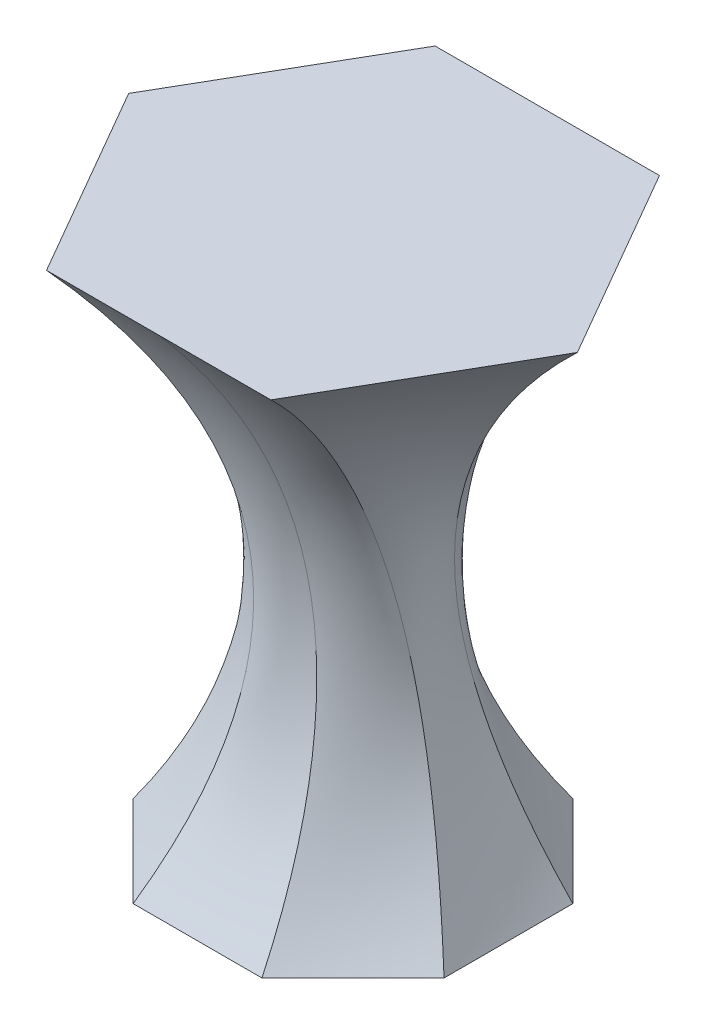
ISO-10303-21;
HEADER;
FILE_DESCRIPTION(('STEP AP214'),'2;1');
FILE_NAME('part.step','',(''),(''),'','','');
FILE_SCHEMA(('AUTOMOTIVE_DESIGN { 1 0 10303 214 1 1 1 1 }'));
ENDSEC;
DATA;
#1=APPLICATION_CONTEXT('core data for automotive mechanical design processes');
#2=APPLICATION_PROTOCOL_DEFINITION('international standard','automotive_design',2000,#1);
#3=PRODUCT_CONTEXT('',#1,'mechanical');
#4=PRODUCT('Part','Part','',(#3));
#5=PRODUCT_RELATED_PRODUCT_CATEGORY('part','',(#4));
#6=PRODUCT_DEFINITION_FORMATION('','',#4);
#7=PRODUCT_DEFINITION_CONTEXT('part definition',#1,'design');
#8=PRODUCT_DEFINITION('design','',#6,#7);
#9=PRODUCT_DEFINITION_SHAPE('','',#8);
#10=(LENGTH_UNIT() NAMED_UNIT(*) SI_UNIT(.MILLI.,.METRE.));
#11=(NAMED_UNIT(*) PLANE_ANGLE_UNIT() SI_UNIT($,.RADIAN.));
#12=(NAMED_UNIT(*) SI_UNIT($,.STERADIAN.) SOLID_ANGLE_UNIT());
#13=UNCERTAINTY_MEASURE_WITH_UNIT(LENGTH_MEASURE(1.E-05),#10,'distance_accuracy_value','');
#14=(GEOMETRIC_REPRESENTATION_CONTEXT(3) GLOBAL_UNCERTAINTY_ASSIGNED_CONTEXT((#13)) GLOBAL_UNIT_ASSIGNED_CONTEXT((#10,
#11,#12)) REPRESENTATION_CONTEXT('',''));
#15=CARTESIAN_POINT('',(0.,0.,0.));
#16=DIRECTION('',(0.,0.,1.));
#17=DIRECTION('',(1.,0.,0.));
#18=AXIS2_PLACEMENT_3D('',#15,#16,#17);
#19=CARTESIAN_POINT('',(0.,140.,0.));
#20=DIRECTION('',(0.,1.,0.));
#21=DIRECTION('',(0.,0.,1.));
#22=AXIS2_PLACEMENT_3D('',#19,#20,#21);
#23=PLANE('',#22);
#24=DIRECTION('',(1.,0.,0.));
#25=VECTOR('',#24,1.);
#26=CARTESIAN_POINT('',(-144.448851571674,140.,41.1277566887757));
#27=LINE('',#26,#25);
#28=CARTESIAN_POINT('',(-144.448851571674,140.,41.1277566887757));
#29=VERTEX_POINT('',#28);
#30=CARTESIAN_POINT('',(-115.581338112193,140.,41.1277566887757));
#31=VERTEX_POINT('',#30);
#32=EDGE_CURVE('E66',#29,#31,#27,.T.);
#33=ORIENTED_EDGE('',*,*,#32,.T.);
#34=CARTESIAN_POINT('',(-86.7138246527114,140.,41.1277566887757));
#35=VERTEX_POINT('',#34);
#36=EDGE_CURVE('E261',#31,#35,#27,.T.);
#37=ORIENTED_EDGE('',*,*,#36,.T.);
#38=DIRECTION('',(0.5,0.,-0.866025403784439));
#39=VECTOR('',#38,1.);
#40=CARTESIAN_POINT('',(-86.7138246527114,140.,41.1277566887757));
#41=LINE('',#40,#39);
#42=CARTESIAN_POINT('',(-57.8463111932301,140.,-8.87224331122428));
#43=VERTEX_POINT('',#42);
#44=EDGE_CURVE('E252',#35,#43,#41,.T.);
#45=ORIENTED_EDGE('',*,*,#44,.T.);
#46=DIRECTION('',(-0.5,0.,-0.866025403784439));
#47=VECTOR('',#46,1.);
#48=CARTESIAN_POINT('',(-57.8463111932301,140.,-8.87224331122428));
#49=LINE('',#48,#47);
#50=CARTESIAN_POINT('',(-86.7138246527114,140.,-58.8722433112243));
#51=VERTEX_POINT('',#50);
#52=EDGE_CURVE('E242',#43,#51,#49,.T.);
#53=ORIENTED_EDGE('',*,*,#52,.T.);
#54=DIRECTION('',(-1.,0.,0.));
#55=VECTOR('',#54,1.);
#56=CARTESIAN_POINT('',(-86.7138246527114,140.,-58.8722433112243));
#57=LINE('',#56,#55);
#58=CARTESIAN_POINT('',(-115.581338112193,140.,-58.8722433112243));
#59=VERTEX_POINT('',#58);
#60=EDGE_CURVE('E74',#51,#59,#57,.T.);
#61=ORIENTED_EDGE('',*,*,#60,.T.);
#62=CARTESIAN_POINT('',(-144.448851571674,140.,-58.8722433112243));
#63=VERTEX_POINT('',#62);
#64=EDGE_CURVE('E148',#59,#63,#57,.T.);
#65=ORIENTED_EDGE('',*,*,#64,.T.);
#66=DIRECTION('',(-0.5,0.,0.866025403784439));
#67=VECTOR('',#66,1.);
#68=CARTESIAN_POINT('',(-144.448851571674,140.,-58.8722433112243));
#69=LINE('',#68,#67);
#70=CARTESIAN_POINT('',(-173.316365031155,140.,-8.87224331122428));
#71=VERTEX_POINT('',#70);
#72=EDGE_CURVE('E59',#63,#71,#69,.T.);
#73=ORIENTED_EDGE('',*,*,#72,.T.);
#74=DIRECTION('',(0.5,0.,0.866025403784438));
#75=VECTOR('',#74,1.);
#76=CARTESIAN_POINT('',(-173.316365031155,140.,-8.87224331122428));
#77=LINE('',#76,#75);
#78=EDGE_CURVE('E12',#71,#29,#77,.T.);
#79=ORIENTED_EDGE('',*,*,#78,.T.);
#80=EDGE_LOOP('',(#33,#37,#45,#53,#61,#65,#73,#79));
#81=FACE_BOUND('',#80,.T.);
#82=ADVANCED_FACE('F49',(#81),#23,.T.);
#83=CARTESIAN_POINT('',(0.,0.,0.));
#84=DIRECTION('',(0.,1.,0.));
#85=DIRECTION('',(0.,0.,1.));
#86=AXIS2_PLACEMENT_3D('',#83,#84,#85);
#87=PLANE('',#86);
#88=DIRECTION('',(-1.,0.,0.));
#89=VECTOR('',#88,1.);
#90=CARTESIAN_POINT('',(-99.0127956172689,0.,-48.8722433112243));
#91=LINE('',#90,#89);
#92=CARTESIAN_POINT('',(-99.0127956172689,0.,-48.8722433112243));
#93=VERTEX_POINT('',#92);
#94=CARTESIAN_POINT('',(-132.149880607117,0.,-48.8722433112243));
#95=VERTEX_POINT('',#94);
#96=EDGE_CURVE('E124',#93,#95,#91,.T.);
#97=ORIENTED_EDGE('',*,*,#96,.F.);
#98=DIRECTION('',(-0.707106781186548,0.,-0.707106781186547));
#99=VECTOR('',#98,1.);
#100=CARTESIAN_POINT('',(-75.5813381121927,0.,-25.4407858061481));
#101=LINE('',#100,#99);
#102=CARTESIAN_POINT('',(-75.5813381121927,0.,-25.4407858061481));
#103=VERTEX_POINT('',#102);
#104=EDGE_CURVE('E388',#103,#93,#101,.T.);
#105=ORIENTED_EDGE('',*,*,#104,.F.);
#106=DIRECTION('',(0.,0.,-1.));
#107=VECTOR('',#106,1.);
#108=CARTESIAN_POINT('',(-75.5813381121927,0.,7.69629918369949));
#109=LINE('',#108,#107);
#110=CARTESIAN_POINT('',(-75.5813381121927,0.,7.69629918369949));
#111=VERTEX_POINT('',#110);
#112=EDGE_CURVE('E401',#111,#103,#109,.T.);
#113=ORIENTED_EDGE('',*,*,#112,.F.);
#114=DIRECTION('',(0.707106781186548,0.,-0.707106781186547));
#115=VECTOR('',#114,1.);
#116=CARTESIAN_POINT('',(-99.0127956172689,0.,31.1277566887757));
#117=LINE('',#116,#115);
#118=CARTESIAN_POINT('',(-99.0127956172689,0.,31.1277566887757));
#119=VERTEX_POINT('',#118);
#120=EDGE_CURVE('E308',#119,#111,#117,.T.);
#121=ORIENTED_EDGE('',*,*,#120,.F.);
#122=DIRECTION('',(1.,0.,0.));
#123=VECTOR('',#122,1.);
#124=CARTESIAN_POINT('',(-132.149880607116,0.,31.1277566887757));
#125=LINE('',#124,#123);
#126=CARTESIAN_POINT('',(-132.149880607116,0.,31.1277566887757));
#127=VERTEX_POINT('',#126);
#128=EDGE_CURVE('E289',#127,#119,#125,.T.);
#129=ORIENTED_EDGE('',*,*,#128,.F.);
#130=DIRECTION('',(0.707106781186548,0.,0.707106781186547));
#131=VECTOR('',#130,1.);
#132=CARTESIAN_POINT('',(-155.581338112193,0.,7.69629918369954));
#133=LINE('',#132,#131);
#134=CARTESIAN_POINT('',(-155.581338112193,0.,7.69629918369954));
#135=VERTEX_POINT('',#134);
#136=EDGE_CURVE('E474',#135,#127,#133,.T.);
#137=ORIENTED_EDGE('',*,*,#136,.F.);
#138=DIRECTION('',(0.,0.,1.));
#139=VECTOR('',#138,1.);
#140=CARTESIAN_POINT('',(-155.581338112193,0.,-25.4407858061481));
#141=LINE('',#140,#139);
#142=CARTESIAN_POINT('',(-155.581338112193,0.,-25.4407858061481));
#143=VERTEX_POINT('',#142);
#144=EDGE_CURVE('E127',#143,#135,#141,.T.);
#145=ORIENTED_EDGE('',*,*,#144,.F.);
#146=DIRECTION('',(-0.707106781186546,0.,0.707106781186548));
#147=VECTOR('',#146,1.);
#148=CARTESIAN_POINT('',(-132.149880607117,0.,-48.8722433112243));
#149=LINE('',#148,#147);
#150=EDGE_CURVE('E120',#95,#143,#149,.T.);
#151=ORIENTED_EDGE('',*,*,#150,.F.);
#152=EDGE_LOOP('',(#97,#105,#113,#121,#129,#137,#145,#151));
#153=FACE_BOUND('',#152,.T.);
#154=ADVANCED_FACE('F123',(#153),#87,.F.);
#155=CARTESIAN_POINT('',(-75.5813381121927,0.,-25.4407858061481));
#156=CARTESIAN_POINT('',(-92.7306903398248,24.5549942298875,-22.1143807487044));
#157=CARTESIAN_POINT('',(-106.985200264323,72.1735908487958,-16.0579170611513));
#158=CARTESIAN_POINT('',(-80.9073390605164,117.888327563221,-11.0686857520886));
#159=CARTESIAN_POINT('',(-57.8463111932301,140.,-8.87224331122428));
#160=CARTESIAN_POINT('',(-83.3918239472181,0.,-33.2512716411735));
#161=CARTESIAN_POINT('',(-97.4580724378477,24.5007882693305,-25.7205703905838));
#162=CARTESIAN_POINT('',(-105.748698651671,72.2279403583067,-19.5111059139139));
#163=CARTESIAN_POINT('',(-86.8427335928516,117.834121602664,-20.5789959483955));
#164=CARTESIAN_POINT('',(-67.4688156797239,140.,-25.538909977891));
#165=CARTESIAN_POINT('',(-91.2023097822435,0.,-41.0617574761989));
#166=CARTESIAN_POINT('',(-102.185454535871,24.4465823087735,-29.3267600324632));
#167=CARTESIAN_POINT('',(-108.244844102785,72.2822898678176,-20.9481371507312));
#168=CARTESIAN_POINT('',(-92.7781281251868,117.779915642107,-30.0893061447024));
#169=CARTESIAN_POINT('',(-77.0913201662176,140.,-42.2055766445576));
#170=CARTESIAN_POINT('',(-99.0127956172689,0.,-48.8722433112243));
#171=CARTESIAN_POINT('',(-106.912836633894,24.3923763482166,-32.9329496743426));
#172=CARTESIAN_POINT('',(-112.757147169846,72.3366393773286,-18.6525213237814));
#173=CARTESIAN_POINT('',(-98.713522657522,117.72570968155,-39.5996163410093));
#174=CARTESIAN_POINT('',(-86.7138246527114,140.,-58.8722433112243));
#175=B_SPLINE_SURFACE_WITH_KNOTS('',3,3,((#155,#156,#157,#158,#159),(#160,#161,#162,#163,#164),
(#165,#166,#167,#168,#169),(#170,#171,#172,#173,#174)),.UNSPECIFIED.,.F.,.F.,.F.,(4,4),(4,1,4),
(0.,1.),(0.,0.481817894882484,1.),.UNSPECIFIED.);
#176=CARTESIAN_POINT('',(-99.0127956172689,0.,-48.8722433112243));
#177=CARTESIAN_POINT('',(-106.912836633894,24.3923763482166,-32.9329496743426));
#178=CARTESIAN_POINT('',(-112.757147169846,72.3366393773286,-18.6525213237814));
#179=CARTESIAN_POINT('',(-98.713522657522,117.72570968155,-39.5996163410093));
#180=CARTESIAN_POINT('',(-86.7138246527114,140.,-58.8722433112243));
#181=B_SPLINE_CURVE_WITH_KNOTS('',3,(#176,#177,#178,#179,#180),.UNSPECIFIED.,.F.,.F.,(4,1,4),
(0.,0.481817894882484,1.),.UNSPECIFIED.);
#182=EDGE_CURVE('E142',#93,#51,#181,.T.);
#183=CARTESIAN_POINT('',(-75.5813381121927,0.,-25.4407858061481));
#184=CARTESIAN_POINT('',(-92.7306903398248,24.5549942298875,-22.1143807487044));
#185=CARTESIAN_POINT('',(-106.985200264323,72.1735908487958,-16.0579170611513));
#186=CARTESIAN_POINT('',(-80.9073390605164,117.888327563221,-11.0686857520886));
#187=CARTESIAN_POINT('',(-57.8463111932301,140.,-8.87224331122428));
#188=B_SPLINE_CURVE_WITH_KNOTS('',3,(#183,#184,#185,#186,#187),.UNSPECIFIED.,.F.,.F.,(4,1,4),
(0.,0.481817894882484,1.),.UNSPECIFIED.);
#189=EDGE_CURVE('E154',#43,#103,#188,.F.);
#190=ORIENTED_EDGE('',*,*,#104,.T.);
#191=ORIENTED_EDGE('',*,*,#182,.T.);
#192=ORIENTED_EDGE('',*,*,#52,.F.);
#193=ORIENTED_EDGE('',*,*,#189,.T.);
#194=EDGE_LOOP('',(#190,#191,#192,#193));
#195=FACE_BOUND('',#194,.T.);
#196=ADVANCED_FACE('F356',(#195),#175,.T.);
#197=CARTESIAN_POINT('',(-99.0127956172689,0.,-48.8722433112243));
#198=CARTESIAN_POINT('',(-106.912836633894,24.3923763482166,-32.9329496743426));
#199=CARTESIAN_POINT('',(-112.757147169846,72.3366393773286,-18.6525213237814));
#200=CARTESIAN_POINT('',(-98.713522657522,117.72570968155,-39.5996163410093));
#201=CARTESIAN_POINT('',(-86.7138246527114,140.,-58.8722433112243));
#202=CARTESIAN_POINT('',(-110.058490613885,0.,-48.8722433112243));
#203=CARTESIAN_POINT('',(-114.241094734915,24.2377738751018,-32.9219066405487));
#204=CARTESIAN_POINT('',(-115.664411053269,72.4916512707924,-22.7286123746275));
#205=CARTESIAN_POINT('',(-105.092987085128,117.571107208435,-39.5885733072154));
#206=CARTESIAN_POINT('',(-96.3363291392051,140.,-58.8722433112243));
#207=CARTESIAN_POINT('',(-121.104185610501,0.,-48.8722433112243));
#208=CARTESIAN_POINT('',(-121.569352835936,24.0831714019871,-32.9108636067548));
#209=CARTESIAN_POINT('',(-119.785416265082,72.6466631642562,-22.739684652732));
#210=CARTESIAN_POINT('',(-111.472451512735,117.41650473532,-39.5775302734215));
#211=CARTESIAN_POINT('',(-105.958833625699,140.,-58.8722433112243));
#212=CARTESIAN_POINT('',(-132.149880607117,0.,-48.8722433112243));
#213=CARTESIAN_POINT('',(-128.897610936957,23.9285689288724,-32.8998205729609));
#214=CARTESIAN_POINT('',(-122.692680148506,72.80167505772,-18.6857381580951));
#215=CARTESIAN_POINT('',(-117.851915940341,117.261902262206,-39.5664872396275));
#216=CARTESIAN_POINT('',(-115.581338112193,140.,-58.8722433112243));
#217=B_SPLINE_SURFACE_WITH_KNOTS('',3,3,((#197,#198,#199,#200,#201),(#202,#203,#204,#205,#206),
(#207,#208,#209,#210,#211),(#212,#213,#214,#215,#216)),.UNSPECIFIED.,.F.,.F.,.F.,(4,4),(4,1,4),
(0.,1.),(0.,0.481817894882484,1.),.UNSPECIFIED.);
#218=CARTESIAN_POINT('',(-132.149880607117,0.,-48.8722433112243));
#219=CARTESIAN_POINT('',(-128.897610936957,23.9285689288724,-32.8998205729609));
#220=CARTESIAN_POINT('',(-122.692680148506,72.80167505772,-18.6857381580951));
#221=CARTESIAN_POINT('',(-117.851915940341,117.261902262206,-39.5664872396275));
#222=CARTESIAN_POINT('',(-115.581338112193,140.,-58.8722433112243));
#223=B_SPLINE_CURVE_WITH_KNOTS('',3,(#218,#219,#220,#221,#222),.UNSPECIFIED.,.F.,.F.,(4,1,4),
(0.,0.481817894882484,1.),.UNSPECIFIED.);
#224=EDGE_CURVE('E141',#95,#59,#223,.T.);
#225=ORIENTED_EDGE('',*,*,#96,.T.);
#226=ORIENTED_EDGE('',*,*,#224,.T.);
#227=ORIENTED_EDGE('',*,*,#60,.F.);
#228=ORIENTED_EDGE('',*,*,#182,.F.);
#229=EDGE_LOOP('',(#225,#226,#227,#228));
#230=FACE_BOUND('',#229,.T.);
#231=ADVANCED_FACE('F140',(#230),#217,.T.);
#232=CARTESIAN_POINT('',(-75.5813381121927,0.,7.69629918369949));
#233=CARTESIAN_POINT('',(-88.1951341083969,24.8542202175706,-3.45567773765355));
#234=CARTESIAN_POINT('',(-102.585536885742,71.8735724468268,-9.33733212589869));
#235=CARTESIAN_POINT('',(-95.616791802076,118.187553550904,18.8319605990639));
#236=CARTESIAN_POINT('',(-86.7138246527114,140.,41.1277566887757));
#237=CARTESIAN_POINT('',(-75.5813381121927,0.,-3.34939581291637));
#238=CARTESIAN_POINT('',(-89.7069861855395,24.7544782216762,-9.67524540800385));
#239=CARTESIAN_POINT('',(-99.9870725725274,71.9735785808164,-11.1729466615196));
#240=CARTESIAN_POINT('',(-90.7136408882228,118.08781155501,8.8650784820131));
#241=CARTESIAN_POINT('',(-77.0913201662176,140.,24.4610900221091));
#242=CARTESIAN_POINT('',(-75.5813381121927,0.,-14.3950908095322));
#243=CARTESIAN_POINT('',(-91.2188382626821,24.6547362257819,-15.8948130783542));
#244=CARTESIAN_POINT('',(-101.453627032054,72.0735847148061,-14.2223025255304));
#245=CARTESIAN_POINT('',(-85.8104899743696,117.988069559115,-1.10180363503773));
#246=CARTESIAN_POINT('',(-67.4688156797239,140.,7.79442335544239));
#247=CARTESIAN_POINT('',(-75.5813381121927,0.,-25.4407858061481));
#248=CARTESIAN_POINT('',(-92.7306903398248,24.5549942298875,-22.1143807487044));
#249=CARTESIAN_POINT('',(-106.985200264323,72.1735908487958,-16.0579170611513));
#250=CARTESIAN_POINT('',(-80.9073390605164,117.888327563221,-11.0686857520886));
#251=CARTESIAN_POINT('',(-57.8463111932301,140.,-8.87224331122427));
#252=B_SPLINE_SURFACE_WITH_KNOTS('',3,3,((#232,#233,#234,#235,#236),(#237,#238,#239,#240,#241),
(#242,#243,#244,#245,#246),(#247,#248,#249,#250,#251)),.UNSPECIFIED.,.F.,.F.,.F.,(4,4),(4,1,4),
(0.,1.),(0.,0.481817894882484,1.),.UNSPECIFIED.);
#253=CARTESIAN_POINT('',(-75.5813381121927,0.,7.69629918369949));
#254=CARTESIAN_POINT('',(-88.1951341083969,24.8542202175706,-3.45567773765355));
#255=CARTESIAN_POINT('',(-102.585536885742,71.8735724468268,-9.33733212589869));
#256=CARTESIAN_POINT('',(-95.616791802076,118.187553550904,18.8319605990639));
#257=CARTESIAN_POINT('',(-86.7138246527114,140.,41.1277566887757));
#258=B_SPLINE_CURVE_WITH_KNOTS('',3,(#253,#254,#255,#256,#257),.UNSPECIFIED.,.F.,.F.,(4,1,4),
(0.,0.481817894882484,1.),.UNSPECIFIED.);
#259=EDGE_CURVE('E262',#111,#35,#258,.T.);
#260=ORIENTED_EDGE('',*,*,#112,.T.);
#261=ORIENTED_EDGE('',*,*,#189,.F.);
#262=ORIENTED_EDGE('',*,*,#44,.F.);
#263=ORIENTED_EDGE('',*,*,#259,.F.);
#264=EDGE_LOOP('',(#260,#261,#262,#263));
#265=FACE_BOUND('',#264,.T.);
#266=ADVANCED_FACE('F183',(#265),#252,.T.);
#267=CARTESIAN_POINT('',(-132.149880607117,0.,-48.8722433112243));
#268=CARTESIAN_POINT('',(-128.897610936957,23.9285689288724,-32.8998205729609));
#269=CARTESIAN_POINT('',(-122.692680148506,72.80167505772,-18.6857381580951));
#270=CARTESIAN_POINT('',(-117.851915940341,117.261902262206,-39.5664872396275));
#271=CARTESIAN_POINT('',(-115.581338112193,140.,-58.8722433112243));
#272=CARTESIAN_POINT('',(-139.960366442142,0.,-41.0617574761989));
#273=CARTESIAN_POINT('',(-133.587587996634,24.2371193584384,-26.6961500102389));
#274=CARTESIAN_POINT('',(-127.242487310438,72.4923075207556,-18.4200275187398));
#275=CARTESIAN_POINT('',(-123.74990543433,117.570452691772,-38.5698072335892));
#276=CARTESIAN_POINT('',(-125.203842598686,140.,-58.8722433112243));
#277=CARTESIAN_POINT('',(-147.770852277167,0.,-33.2512716411735));
#278=CARTESIAN_POINT('',(-138.277565056311,24.5456697880045,-20.492479447517));
#279=CARTESIAN_POINT('',(-129.776136856424,72.1829399837912,-14.4216698156175));
#280=CARTESIAN_POINT('',(-129.64789492832,117.879003121338,-37.5731272275509));
#281=CARTESIAN_POINT('',(-134.82634708518,140.,-58.8722433112243));
#282=CARTESIAN_POINT('',(-155.581338112193,0.,-25.4407858061481));
#283=CARTESIAN_POINT('',(-142.967542115989,24.8542202175706,-14.288808884795));
#284=CARTESIAN_POINT('',(-128.577139338643,71.8735724468268,-8.40715449654989));
#285=CARTESIAN_POINT('',(-135.545884422309,118.187553550904,-36.5764472215125));
#286=CARTESIAN_POINT('',(-144.448851571674,140.,-58.8722433112243));
#287=B_SPLINE_SURFACE_WITH_KNOTS('',3,3,((#267,#268,#269,#270,#271),(#272,#273,#274,#275,#276),
(#277,#278,#279,#280,#281),(#282,#283,#284,#285,#286)),.UNSPECIFIED.,.F.,.F.,.F.,(4,4),(4,1,4),
(0.,1.),(0.,0.481817894882484,1.),.UNSPECIFIED.);
#288=CARTESIAN_POINT('',(-155.581338112193,0.,-25.4407858061481));
#289=CARTESIAN_POINT('',(-142.967542115989,24.8542202175706,-14.288808884795));
#290=CARTESIAN_POINT('',(-128.577139338643,71.8735724468268,-8.40715449654989));
#291=CARTESIAN_POINT('',(-135.545884422309,118.187553550904,-36.5764472215125));
#292=CARTESIAN_POINT('',(-144.448851571674,140.,-58.8722433112243));
#293=B_SPLINE_CURVE_WITH_KNOTS('',3,(#288,#289,#290,#291,#292),.UNSPECIFIED.,.F.,.F.,(4,1,4),
(0.,0.481817894882484,1.),.UNSPECIFIED.);
#294=EDGE_CURVE('E150',#143,#63,#293,.T.);
#295=ORIENTED_EDGE('',*,*,#150,.T.);
#296=ORIENTED_EDGE('',*,*,#294,.T.);
#297=ORIENTED_EDGE('',*,*,#64,.F.);
#298=ORIENTED_EDGE('',*,*,#224,.F.);
#299=EDGE_LOOP('',(#295,#296,#297,#298));
#300=FACE_BOUND('',#299,.T.);
#301=ADVANCED_FACE('F147',(#300),#287,.T.);
#302=CARTESIAN_POINT('',(-155.581338112193,0.,-25.4407858061481));
#303=CARTESIAN_POINT('',(-142.967542115989,24.8542202175706,-14.288808884795));
#304=CARTESIAN_POINT('',(-128.577139338643,71.8735724468268,-8.40715449654989));
#305=CARTESIAN_POINT('',(-135.545884422309,118.187553550904,-36.5764472215125));
#306=CARTESIAN_POINT('',(-144.448851571674,140.,-58.8722433112243));
#307=CARTESIAN_POINT('',(-155.581338112193,0.,-14.3950908095322));
#308=CARTESIAN_POINT('',(-141.455690038846,24.7544782216762,-8.06924121444472));
#309=CARTESIAN_POINT('',(-131.175603651858,71.9735785808164,-6.57153996092898));
#310=CARTESIAN_POINT('',(-140.449035336163,118.08781155501,-26.6095651044617));
#311=CARTESIAN_POINT('',(-154.071356058168,140.,-42.2055766445576));
#312=CARTESIAN_POINT('',(-155.581338112193,0.,-3.34939581291633));
#313=CARTESIAN_POINT('',(-139.943837961703,24.6547362257819,-1.84967354409441));
#314=CARTESIAN_POINT('',(-129.709049192331,72.0735847148061,-3.52218409691814));
#315=CARTESIAN_POINT('',(-145.352186250016,117.988069559115,-16.6426829874108));
#316=CARTESIAN_POINT('',(-163.693860544662,140.,-25.538909977891));
#317=CARTESIAN_POINT('',(-155.581338112193,0.,7.69629918369954));
#318=CARTESIAN_POINT('',(-138.431985884561,24.5549942298875,4.3698941262559));
#319=CARTESIAN_POINT('',(-124.177475960063,72.1735908487958,-1.68656956129724));
#320=CARTESIAN_POINT('',(-150.255337163869,117.888327563221,-6.67580087035998));
#321=CARTESIAN_POINT('',(-173.316365031155,140.,-8.87224331122428));
#322=B_SPLINE_SURFACE_WITH_KNOTS('',3,3,((#302,#303,#304,#305,#306),(#307,#308,#309,#310,#311),
(#312,#313,#314,#315,#316),(#317,#318,#319,#320,#321)),.UNSPECIFIED.,.F.,.F.,.F.,(4,4),(4,1,4),
(0.,1.),(0.,0.481817894882484,1.),.UNSPECIFIED.);
#323=CARTESIAN_POINT('',(-155.581338112193,0.,7.69629918369954));
#324=CARTESIAN_POINT('',(-138.431985884561,24.5549942298875,4.3698941262559));
#325=CARTESIAN_POINT('',(-124.177475960063,72.1735908487958,-1.68656956129724));
#326=CARTESIAN_POINT('',(-150.255337163869,117.888327563221,-6.67580087035998));
#327=CARTESIAN_POINT('',(-173.316365031155,140.,-8.87224331122428));
#328=B_SPLINE_CURVE_WITH_KNOTS('',3,(#323,#324,#325,#326,#327),.UNSPECIFIED.,.F.,.F.,(4,1,4),
(0.,0.481817894882484,1.),.UNSPECIFIED.);
#329=EDGE_CURVE('E152',#135,#71,#328,.T.);
#330=ORIENTED_EDGE('',*,*,#144,.T.);
#331=ORIENTED_EDGE('',*,*,#329,.T.);
#332=ORIENTED_EDGE('',*,*,#72,.F.);
#333=ORIENTED_EDGE('',*,*,#294,.F.);
#334=EDGE_LOOP('',(#330,#331,#332,#333));
#335=FACE_BOUND('',#334,.T.);
#336=ADVANCED_FACE('F182',(#335),#322,.T.);
#337=CARTESIAN_POINT('',(-155.581338112193,0.,7.69629918369954));
#338=CARTESIAN_POINT('',(-138.431985884561,24.5549942298875,4.3698941262559));
#339=CARTESIAN_POINT('',(-124.177475960063,72.1735908487958,-1.68656956129724));
#340=CARTESIAN_POINT('',(-150.255337163869,117.888327563221,-6.67580087035998));
#341=CARTESIAN_POINT('',(-173.316365031155,140.,-8.87224331122428));
#342=CARTESIAN_POINT('',(-147.770852277167,0.,15.5067850187249));
#343=CARTESIAN_POINT('',(-133.704603786538,24.5007882693305,7.97608376813529));
#344=CARTESIAN_POINT('',(-125.413977572715,72.2279403583067,1.76661929146532));
#345=CARTESIAN_POINT('',(-144.319942631534,117.834121602664,2.83450932594692));
#346=CARTESIAN_POINT('',(-163.693860544662,140.,7.79442335544238));
#347=CARTESIAN_POINT('',(-139.960366442142,0.,23.3172708537503));
#348=CARTESIAN_POINT('',(-128.977221688515,24.4465823087735,11.5822734100147));
#349=CARTESIAN_POINT('',(-122.9178321216,72.2822898678176,3.20365052828259));
#350=CARTESIAN_POINT('',(-138.384548099199,117.779915642107,12.3448195222538));
#351=CARTESIAN_POINT('',(-154.071356058168,140.,24.461090022109));
#352=CARTESIAN_POINT('',(-132.149880607116,0.,31.1277566887757));
#353=CARTESIAN_POINT('',(-124.249839590492,24.3923763482166,15.1884630518941));
#354=CARTESIAN_POINT('',(-118.40552905454,72.3366393773286,0.908034701332858));
#355=CARTESIAN_POINT('',(-132.449153566863,117.72570968155,21.8551297185607));
#356=CARTESIAN_POINT('',(-144.448851571674,140.,41.1277566887757));
#357=B_SPLINE_SURFACE_WITH_KNOTS('',3,3,((#337,#338,#339,#340,#341),(#342,#343,#344,#345,#346),
(#347,#348,#349,#350,#351),(#352,#353,#354,#355,#356)),.UNSPECIFIED.,.F.,.F.,.F.,(4,4),(4,1,4),
(0.,1.),(0.,0.481817894882484,1.),.UNSPECIFIED.);
#358=CARTESIAN_POINT('',(-132.149880607116,0.,31.1277566887757));
#359=CARTESIAN_POINT('',(-124.249839590492,24.3923763482166,15.1884630518941));
#360=CARTESIAN_POINT('',(-118.40552905454,72.3366393773286,0.908034701332858));
#361=CARTESIAN_POINT('',(-132.449153566863,117.72570968155,21.8551297185607));
#362=CARTESIAN_POINT('',(-144.448851571674,140.,41.1277566887757));
#363=B_SPLINE_CURVE_WITH_KNOTS('',3,(#358,#359,#360,#361,#362),.UNSPECIFIED.,.F.,.F.,(4,1,4),
(0.,0.481817894882484,1.),.UNSPECIFIED.);
#364=EDGE_CURVE('E291',#127,#29,#363,.T.);
#365=ORIENTED_EDGE('',*,*,#136,.T.);
#366=ORIENTED_EDGE('',*,*,#364,.T.);
#367=ORIENTED_EDGE('',*,*,#78,.F.);
#368=ORIENTED_EDGE('',*,*,#329,.F.);
#369=EDGE_LOOP('',(#365,#366,#367,#368));
#370=FACE_BOUND('',#369,.T.);
#371=ADVANCED_FACE('F440',(#370),#357,.T.);
#372=CARTESIAN_POINT('',(-132.149880607116,0.,31.1277566887757));
#373=CARTESIAN_POINT('',(-124.249839590492,24.3923763482166,15.1884630518941));
#374=CARTESIAN_POINT('',(-118.40552905454,72.3366393773286,0.908034701332842));
#375=CARTESIAN_POINT('',(-132.449153566863,117.72570968155,21.8551297185607));
#376=CARTESIAN_POINT('',(-144.448851571674,140.,41.1277566887757));
#377=CARTESIAN_POINT('',(-121.104185610501,0.,31.1277566887757));
#378=CARTESIAN_POINT('',(-116.921581489471,24.2377738751018,15.1774200181002));
#379=CARTESIAN_POINT('',(-115.498265171116,72.4916512707924,4.98412575217894));
#380=CARTESIAN_POINT('',(-126.069689139257,117.571107208435,21.8440866847668));
#381=CARTESIAN_POINT('',(-134.82634708518,140.,41.1277566887757));
#382=CARTESIAN_POINT('',(-110.058490613885,0.,31.1277566887757));
#383=CARTESIAN_POINT('',(-109.59332338845,24.0831714019871,15.1663769843063));
#384=CARTESIAN_POINT('',(-111.377259959303,72.6466631642562,4.99519803028351));
#385=CARTESIAN_POINT('',(-119.690224711651,117.41650473532,21.8330436509729));
#386=CARTESIAN_POINT('',(-125.203842598686,140.,41.1277566887757));
#387=CARTESIAN_POINT('',(-99.0127956172689,0.,31.1277566887757));
#388=CARTESIAN_POINT('',(-102.265065287429,23.9285689288724,15.1553339505123));
#389=CARTESIAN_POINT('',(-108.46999607588,72.80167505772,0.941251535646539));
#390=CARTESIAN_POINT('',(-113.310760284044,117.261902262206,21.822000617179));
#391=CARTESIAN_POINT('',(-115.581338112193,140.,41.1277566887757));
#392=B_SPLINE_SURFACE_WITH_KNOTS('',3,3,((#372,#373,#374,#375,#376),(#377,#378,#379,#380,#381),
(#382,#383,#384,#385,#386),(#387,#388,#389,#390,#391)),.UNSPECIFIED.,.F.,.F.,.F.,(4,4),(4,1,4),
(0.,1.),(0.,0.481817894882484,1.),.UNSPECIFIED.);
#393=CARTESIAN_POINT('',(-99.0127956172689,0.,31.1277566887757));
#394=CARTESIAN_POINT('',(-102.265065287429,23.9285689288724,15.1553339505123));
#395=CARTESIAN_POINT('',(-108.46999607588,72.80167505772,0.941251535646539));
#396=CARTESIAN_POINT('',(-113.310760284044,117.261902262206,21.822000617179));
#397=CARTESIAN_POINT('',(-115.581338112193,140.,41.1277566887757));
#398=B_SPLINE_CURVE_WITH_KNOTS('',3,(#393,#394,#395,#396,#397),.UNSPECIFIED.,.F.,.F.,(4,1,4),
(0.,0.481817894882484,1.),.UNSPECIFIED.);
#399=EDGE_CURVE('E279',#119,#31,#398,.T.);
#400=ORIENTED_EDGE('',*,*,#128,.T.);
#401=ORIENTED_EDGE('',*,*,#399,.T.);
#402=ORIENTED_EDGE('',*,*,#32,.F.);
#403=ORIENTED_EDGE('',*,*,#364,.F.);
#404=EDGE_LOOP('',(#400,#401,#402,#403));
#405=FACE_BOUND('',#404,.T.);
#406=ADVANCED_FACE('F285',(#405),#392,.T.);
#407=CARTESIAN_POINT('',(-99.0127956172689,0.,31.1277566887757));
#408=CARTESIAN_POINT('',(-102.265065287429,23.9285689288724,15.1553339505123));
#409=CARTESIAN_POINT('',(-108.46999607588,72.80167505772,0.941251535646534));
#410=CARTESIAN_POINT('',(-113.310760284044,117.261902262206,21.822000617179));
#411=CARTESIAN_POINT('',(-115.581338112193,140.,41.1277566887757));
#412=CARTESIAN_POINT('',(-91.2023097822435,0.,23.3172708537503));
#413=CARTESIAN_POINT('',(-97.5750882277513,24.2371193584384,8.95166338779038));
#414=CARTESIAN_POINT('',(-103.920188913948,72.4923075207556,0.67554089629127));
#415=CARTESIAN_POINT('',(-107.412770790055,117.570452691772,20.8253206111406));
#416=CARTESIAN_POINT('',(-105.958833625699,140.,41.1277566887757));
#417=CARTESIAN_POINT('',(-83.3918239472181,0.,15.5067850187249));
#418=CARTESIAN_POINT('',(-92.8851111680741,24.5456697880045,2.74799282506841));
#419=CARTESIAN_POINT('',(-101.386539367961,72.1829399837912,-3.3228168068311));
#420=CARTESIAN_POINT('',(-101.514781296065,117.879003121338,19.8286406051023));
#421=CARTESIAN_POINT('',(-96.3363291392051,140.,41.1277566887757));
#422=CARTESIAN_POINT('',(-75.5813381121927,0.,7.69629918369949));
#423=CARTESIAN_POINT('',(-88.1951341083969,24.8542202175706,-3.45567773765355));
#424=CARTESIAN_POINT('',(-102.585536885742,71.8735724468268,-9.33733212589869));
#425=CARTESIAN_POINT('',(-95.616791802076,118.187553550904,18.8319605990639));
#426=CARTESIAN_POINT('',(-86.7138246527114,140.,41.1277566887757));
#427=B_SPLINE_SURFACE_WITH_KNOTS('',3,3,((#407,#408,#409,#410,#411),(#412,#413,#414,#415,#416),
(#417,#418,#419,#420,#421),(#422,#423,#424,#425,#426)),.UNSPECIFIED.,.F.,.F.,.F.,(4,4),(4,1,4),
(0.,1.),(0.,0.481817894882484,1.),.UNSPECIFIED.);
#428=ORIENTED_EDGE('',*,*,#120,.T.);
#429=ORIENTED_EDGE('',*,*,#259,.T.);
#430=ORIENTED_EDGE('',*,*,#36,.F.);
#431=ORIENTED_EDGE('',*,*,#399,.F.);
#432=EDGE_LOOP('',(#428,#429,#430,#431));
#433=FACE_BOUND('',#432,.T.);
#434=ADVANCED_FACE('F278',(#433),#427,.T.);
#435=CLOSED_SHELL('',(#82,#154,#196,#231,#266,#301,#336,#371,#406,#434));
#436=MANIFOLD_SOLID_BREP('B2',#435);
#437=ADVANCED_BREP_SHAPE_REPRESENTATION('',(#18,#436),#14);
#438=SHAPE_DEFINITION_REPRESENTATION(#9,#437);
ENDSEC;
END-ISO-10303-21;
